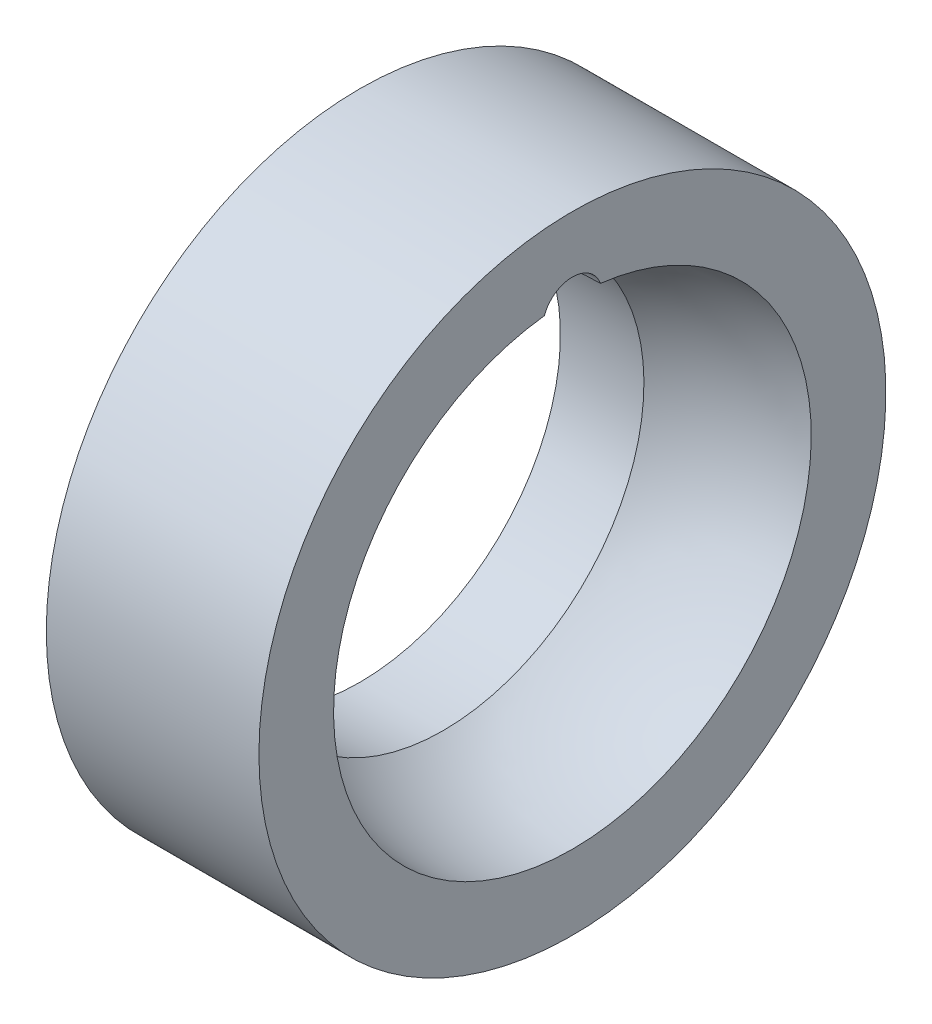
ISO-10303-21;
HEADER;
FILE_DESCRIPTION(('STEP AP214'),'2;1');
FILE_NAME('part.step','',(''),(''),'','','');
FILE_SCHEMA(('AUTOMOTIVE_DESIGN { 1 0 10303 214 1 1 1 1 }'));
ENDSEC;
DATA;
#1=APPLICATION_CONTEXT('core data for automotive mechanical design processes');
#2=APPLICATION_PROTOCOL_DEFINITION('international standard','automotive_design',2000,#1);
#3=PRODUCT_CONTEXT('',#1,'mechanical');
#4=PRODUCT('Part','Part','',(#3));
#5=PRODUCT_RELATED_PRODUCT_CATEGORY('part','',(#4));
#6=PRODUCT_DEFINITION_FORMATION('','',#4);
#7=PRODUCT_DEFINITION_CONTEXT('part definition',#1,'design');
#8=PRODUCT_DEFINITION('design','',#6,#7);
#9=PRODUCT_DEFINITION_SHAPE('','',#8);
#10=(LENGTH_UNIT() NAMED_UNIT(*) SI_UNIT(.MILLI.,.METRE.));
#11=(NAMED_UNIT(*) PLANE_ANGLE_UNIT() SI_UNIT($,.RADIAN.));
#12=(NAMED_UNIT(*) SI_UNIT($,.STERADIAN.) SOLID_ANGLE_UNIT());
#13=UNCERTAINTY_MEASURE_WITH_UNIT(LENGTH_MEASURE(1.E-05),#10,'distance_accuracy_value','');
#14=(GEOMETRIC_REPRESENTATION_CONTEXT(3) GLOBAL_UNCERTAINTY_ASSIGNED_CONTEXT((#13)) GLOBAL_UNIT_ASSIGNED_CONTEXT((#10,
#11,#12)) REPRESENTATION_CONTEXT('',''));
#15=CARTESIAN_POINT('',(0.,0.,0.));
#16=DIRECTION('',(0.,0.,1.));
#17=DIRECTION('',(1.,0.,0.));
#18=AXIS2_PLACEMENT_3D('',#15,#16,#17);
#19=CARTESIAN_POINT('',(20.1221335353163,0.,0.));
#20=DIRECTION('',(-1.,0.,0.));
#21=DIRECTION('',(0.,0.,1.));
#22=AXIS2_PLACEMENT_3D('',#19,#20,#21);
#23=DEGENERATE_TOROIDAL_SURFACE('',#22,7.64433946143228E-05,40.,.T.);
#24=CARTESIAN_POINT('',(-15.6421895674782,17.2811774003063,-4.71983468836695));
#25=CARTESIAN_POINT('',(-15.2759094662814,18.039375351379,-4.71957062717062));
#26=CARTESIAN_POINT('',(-14.8854597789707,18.7858851714259,-4.71928898190261));
#27=CARTESIAN_POINT('',(-14.0580147759953,20.2524704751657,-4.71869164080727));
#28=CARTESIAN_POINT('',(-13.6210278510322,20.9725506927613,-4.71837595111806));
#29=CARTESIAN_POINT('',(-12.7016849026117,22.3842368413886,-4.71771119302702));
#30=CARTESIAN_POINT('',(-12.2192815767361,23.0758119815962,-4.71736208981767));
#31=CARTESIAN_POINT('',(-11.211412658642,24.4269654886847,-4.71663197884782));
#32=CARTESIAN_POINT('',(-10.6859397885119,25.0865384177153,-4.71625096569494));
#33=CARTESIAN_POINT('',(-9.41688332634966,26.5793554903486,-4.71532976651777));
#34=CARTESIAN_POINT('',(-8.6578392707403,27.3995357837632,-4.71477803823838));
#35=CARTESIAN_POINT('',(-7.07328234131406,28.9731399255364,-4.71362437186993));
#36=CARTESIAN_POINT('',(-6.24775770799117,29.7265519137693,-4.71302242489717));
#37=CARTESIAN_POINT('',(-4.53585980904716,31.1614361084501,-4.71177194055376));
#38=CARTESIAN_POINT('',(-3.64946477067534,31.8428823499325,-4.7111233865083));
#39=CARTESIAN_POINT('',(-1.82246757275344,33.1286166937965,-4.70978407789049));
#40=CARTESIAN_POINT('',(-0.88186884754735,33.7329096768222,-4.70909332599163));
#41=CARTESIAN_POINT('',(1.04704523012668,34.8601814794487,-4.70767395027811));
#42=CARTESIAN_POINT('',(2.0353678309726,35.3831478958113,-4.70694532070925));
#43=CARTESIAN_POINT('',(4.05266715474154,36.343978425912,-4.70545499245545));
#44=CARTESIAN_POINT('',(5.08164748983984,36.7818349576416,-4.70469329083168));
#45=CARTESIAN_POINT('',(7.17214736284044,37.5690157923693,-4.70314247596952));
#46=CARTESIAN_POINT('',(8.23364578718109,37.9183962310181,-4.70235338047503));
#47=CARTESIAN_POINT('',(10.3820974273785,38.5264342162221,-4.70075275727532));
#48=CARTESIAN_POINT('',(11.4690426573696,38.7851198285868,-4.69994123659365));
#49=CARTESIAN_POINT('',(13.180976714135,39.1170471852923,-4.69866024985119));
#50=CARTESIAN_POINT('',(13.8000098295327,39.2219054474565,-4.69819647520254));
#51=CARTESIAN_POINT('',(15.0424118188191,39.4021840288831,-4.69726451216471));
#52=CARTESIAN_POINT('',(15.6657808391783,39.4776033487095,-4.69679632362622));
#53=CARTESIAN_POINT('',(16.9142559097397,39.5987014405652,-4.69585746397916));
#54=CARTESIAN_POINT('',(17.5393568038199,39.6444335733849,-4.69538679886634));
#55=CARTESIAN_POINT('',(18.7910036274531,39.7062870284667,-4.69444319907033));
#56=CARTESIAN_POINT('',(19.4175495147356,39.7224092061792,-4.69397026445309));
#57=CARTESIAN_POINT('',(20.0441320920677,39.7236846216102,-4.6934967053881));
#58=B_SPLINE_CURVE_WITH_KNOTS('',3,(#24,#25,#26,#27,#28,#29,#30,#31,#32,#33,#34,#35,#36,#37,#38,
#39,#40,#41,#42,#43,#44,#45,#46,#47,#48,#49,#50,#51,#52,#53,#54,#55,#56,#57),.UNSPECIFIED.,.F.,
.F.,(4,2,2,2,2,2,2,2,2,2,2,2,2,2,2,2,4),(0.,2.52566580639146,5.05087700171165,7.57874799959324,
10.1070470424515,13.455450692087,16.8044479350535,20.1546493847703,23.5046387987118,
26.85513862462,30.2059367929227,33.5546036149888,36.9022332646503,38.7851823646233,
40.6681953841313,42.5478143691044,44.4273790498379),.UNSPECIFIED.);
#59=CARTESIAN_POINT('',(-1.57648479448589,33.2715304538644,-4.70960309524829));
#60=VERTEX_POINT('',#59);
#61=CARTESIAN_POINT('',(20.0439320920677,39.7236842105263,-4.69349685654329));
#62=VERTEX_POINT('',#61);
#63=EDGE_CURVE('E56',#60,#62,#58,.T.);
#64=ORIENTED_EDGE('',*,*,#63,.F.);
#65=CARTESIAN_POINT('',(-1.57648479448589,0.,0.));
#66=DIRECTION('',(1.,0.,0.));
#67=DIRECTION('',(0.,0.,-1.));
#68=AXIS2_PLACEMENT_3D('',#65,#66,#67);
#69=CIRCLE('',#68,33.6032007412567);
#70=CARTESIAN_POINT('',(-1.57648479448579,33.2715304538644,4.70960309524831));
#71=VERTEX_POINT('',#70);
#72=EDGE_CURVE('E49',#60,#71,#69,.F.);
#73=ORIENTED_EDGE('',*,*,#72,.T.);
#74=CARTESIAN_POINT('',(20.0441320920677,39.7236846216102,4.6934967053881));
#75=CARTESIAN_POINT('',(19.2020977600012,39.7219935452299,4.69413310124834));
#76=CARTESIAN_POINT('',(18.360128119361,39.6934553314011,4.69476836651866));
#77=CARTESIAN_POINT('',(16.6798513751535,39.5829764240403,4.69603401399014));
#78=CARTESIAN_POINT('',(15.8415436396381,39.5010453434236,4.69666439704964));
#79=CARTESIAN_POINT('',(14.1709388640504,39.2839574043864,4.69791854932067));
#80=CARTESIAN_POINT('',(13.3386490858657,39.1487445689039,4.69854231086569));
#81=CARTESIAN_POINT('',(11.6842544026417,38.8256463592424,4.69978015586335));
#82=CARTESIAN_POINT('',(10.8621512460708,38.6377520698997,4.70039423765931));
#83=CARTESIAN_POINT('',(8.9669294331129,38.1406105195804,4.70180759884834));
#84=CARTESIAN_POINT('',(7.89888807572996,37.8117694630523,4.7026023389578));
#85=CARTESIAN_POINT('',(5.79417999172329,37.0652606022522,4.7041652030577));
#86=CARTESIAN_POINT('',(4.7575188606651,36.6475770613764,4.70493332230476));
#87=CARTESIAN_POINT('',(2.72267764550524,35.7262033147961,4.70643801682719));
#88=CARTESIAN_POINT('',(1.72451153147418,35.2224822389668,4.70717458066148));
#89=CARTESIAN_POINT('',(-0.225759257360639,34.1327588563438,4.70861095669298));
#90=CARTESIAN_POINT('',(-1.17786684346002,33.5467617592642,4.7093107712133));
#91=CARTESIAN_POINT('',(-3.02946274596384,32.2965360673289,4.7106692626734));
#92=CARTESIAN_POINT('',(-3.92894304052079,31.6322955922854,4.71132793334275));
#93=CARTESIAN_POINT('',(-5.66881095448404,30.230307450833,4.71259985572707));
#94=CARTESIAN_POINT('',(-6.5091933048119,29.4925532441944,4.71321310339245));
#95=CARTESIAN_POINT('',(-8.12425851096681,27.9493658748685,4.71438983708653));
#96=CARTESIAN_POINT('',(-8.89898281846065,27.1439760615499,4.71495335452067));
#97=CARTESIAN_POINT('',(-10.3776885275345,25.4709537232032,4.71602744120769));
#98=CARTESIAN_POINT('',(-11.0816917663283,24.6033405541724,4.71653802680641));
#99=CARTESIAN_POINT('',(-12.1224402166282,23.2041517450131,4.71729192492435));
#100=CARTESIAN_POINT('',(-12.4851020696186,22.6916400905935,4.71755443427787));
#101=CARTESIAN_POINT('',(-13.1857716142651,21.649957054734,4.71806128199336));
#102=CARTESIAN_POINT('',(-13.5237784686572,21.1207851083969,4.71830561973825));
#103=CARTESIAN_POINT('',(-14.1737395640294,20.0479926104995,4.71877519149096));
#104=CARTESIAN_POINT('',(-14.4857396646426,19.5043998205052,4.71900045913793));
#105=CARTESIAN_POINT('',(-15.0836776832613,18.4030850132656,4.71943195550539));
#106=CARTESIAN_POINT('',(-15.3696163538505,17.845363404617,4.71963818477565));
#107=CARTESIAN_POINT('',(-15.6421895674782,17.2811774003063,4.71983468836695));
#108=B_SPLINE_CURVE_WITH_KNOTS('',3,(#74,#75,#76,#77,#78,#79,#80,#81,#82,#83,#84,#85,#86,#87,
#88,#89,#90,#91,#92,#93,#94,#95,#96,#97,#98,#99,#100,#101,#102,#103,#104,#105,#106,#107),
.UNSPECIFIED.,.F.,.F.,(4,2,2,2,2,2,2,2,2,2,2,2,2,2,2,2,4),(0.,2.52566539656058,5.05087619489672,
7.57874704756247,10.1070459445906,13.4554569973194,16.804461646277,20.1546704464661,
23.5046672071691,26.8551732763477,30.2059776935552,33.5546506507731,36.9022864075529,
38.7852221765655,40.6682218588213,42.547827587021,44.427379020074),.UNSPECIFIED.);
#109=CARTESIAN_POINT('',(20.0439320920677,39.7236842105263,4.69349685654334));
#110=VERTEX_POINT('',#109);
#111=EDGE_CURVE('E69',#110,#71,#108,.T.);
#112=ORIENTED_EDGE('',*,*,#111,.F.);
#113=CARTESIAN_POINT('',(20.0439320920677,0.,0.));
#114=DIRECTION('',(-1.,0.,0.));
#115=DIRECTION('',(0.,0.,1.));
#116=AXIS2_PLACEMENT_3D('',#113,#114,#115);
#117=CIRCLE('',#116,40.);
#118=EDGE_CURVE('E11',#62,#110,#117,.T.);
#119=ORIENTED_EDGE('',*,*,#118,.F.);
#120=EDGE_LOOP('',(#64,#73,#112,#119));
#121=FACE_BOUND('',#120,.T.);
#122=ADVANCED_FACE('F35',(#121),#23,.F.);
#123=CARTESIAN_POINT('',(20.0439320920677,40.,0.));
#124=DIRECTION('',(-1.,0.,0.));
#125=DIRECTION('',(0.,0.,1.));
#126=AXIS2_PLACEMENT_3D('',#123,#124,#125);
#127=PLANE('',#126);
#128=CARTESIAN_POINT('',(20.0439320920677,38.,0.));
#129=DIRECTION('',(1.,0.,0.));
#130=DIRECTION('',(0.,0.,-1.));
#131=AXIS2_PLACEMENT_3D('',#128,#129,#130);
#132=CIRCLE('',#131,5.);
#133=EDGE_CURVE('E73',#62,#110,#132,.T.);
#134=ORIENTED_EDGE('',*,*,#133,.F.);
#135=ORIENTED_EDGE('',*,*,#118,.T.);
#136=EDGE_LOOP('',(#134,#135));
#137=FACE_BOUND('',#136,.T.);
#138=CARTESIAN_POINT('',(20.0439320920677,0.,0.));
#139=DIRECTION('',(-1.,0.,0.));
#140=DIRECTION('',(0.,0.,1.));
#141=AXIS2_PLACEMENT_3D('',#138,#139,#140);
#142=CIRCLE('',#141,52.5);
#143=CARTESIAN_POINT('',(20.0439320920677,0.,52.5));
#144=VERTEX_POINT('',#143);
#145=EDGE_CURVE('E43',#144,#144,#142,.T.);
#146=ORIENTED_EDGE('',*,*,#145,.F.);
#147=EDGE_LOOP('',(#146));
#148=FACE_BOUND('',#147,.T.);
#149=ADVANCED_FACE('F110',(#137,#148),#127,.F.);
#150=CARTESIAN_POINT('',(-142.821782178218,0.,0.));
#151=DIRECTION('',(-1.,0.,0.));
#152=DIRECTION('',(0.,0.,1.));
#153=AXIS2_PLACEMENT_3D('',#150,#151,#152);
#154=CYLINDRICAL_SURFACE('',#153,52.5);
#155=CARTESIAN_POINT('',(-15.5635250098427,0.,0.));
#156=DIRECTION('',(1.,0.,0.));
#157=DIRECTION('',(0.,1.,0.));
#158=AXIS2_PLACEMENT_3D('',#155,#156,#157);
#159=CIRCLE('',#158,52.5);
#160=CARTESIAN_POINT('',(-15.5635250098427,52.5,0.));
#161=VERTEX_POINT('',#160);
#162=EDGE_CURVE('E70',#161,#161,#159,.T.);
#163=ORIENTED_EDGE('',*,*,#162,.T.);
#164=EDGE_LOOP('',(#163));
#165=FACE_BOUND('',#164,.T.);
#166=ORIENTED_EDGE('',*,*,#145,.T.);
#167=EDGE_LOOP('',(#166));
#168=FACE_BOUND('',#167,.T.);
#169=ADVANCED_FACE('F92',(#165,#168),#154,.T.);
#170=CARTESIAN_POINT('',(20.0439320920677,0.,0.));
#171=DIRECTION('',(0.,0.,1.));
#172=DIRECTION('',(1.,0.,0.));
#173=AXIS2_PLACEMENT_3D('',#170,#171,#172);
#174=TOROIDAL_SURFACE('',#173,38.,5.);
#175=CARTESIAN_POINT('',(20.0441320920677,33.5286197375245,-2.23757872569411));
#176=CARTESIAN_POINT('',(19.8614359959345,33.5286203766609,-2.23755049472049));
#177=CARTESIAN_POINT('',(19.6787453807373,33.528444301127,-2.24020721472335));
#178=CARTESIAN_POINT('',(19.3135365267476,33.5277425241715,-2.25069566483876));
#179=CARTESIAN_POINT('',(19.1310182684824,33.5272168686286,-2.25852671587375));
#180=CARTESIAN_POINT('',(18.7664902408934,33.5258205863803,-2.2791564267382));
#181=CARTESIAN_POINT('',(18.5844801227985,33.5249503817334,-2.29194900850621));
#182=CARTESIAN_POINT('',(18.2208444622175,33.5228721913829,-2.32214770104332));
#183=CARTESIAN_POINT('',(18.0392189314854,33.5216641955015,-2.33955395082194));
#184=CARTESIAN_POINT('',(17.4965397322085,33.5175579709359,-2.39789956366987));
#185=CARTESIAN_POINT('',(17.1361533699163,33.5141714989145,-2.44505923534508));
#186=CARTESIAN_POINT('',(16.4172435048074,33.5061832246551,-2.55218529951695));
#187=CARTESIAN_POINT('',(16.0587206728647,33.5015810119904,-2.61215601563452));
#188=CARTESIAN_POINT('',(15.3416893285763,33.4912491143816,-2.74145136188306));
#189=CARTESIAN_POINT('',(14.9831886007053,33.4855142973166,-2.81081810086654));
#190=CARTESIAN_POINT('',(14.2674451959428,33.4730610253935,-2.95542772996307));
#191=CARTESIAN_POINT('',(13.9102024025879,33.4663426641849,-3.03067006030531));
#192=CARTESIAN_POINT('',(13.1960561615703,33.4520624054686,-3.18442955074408));
#193=CARTESIAN_POINT('',(12.8391534566264,33.4444996353426,-3.26295004508112));
#194=CARTESIAN_POINT('',(12.1255768859799,33.4287061780495,-3.42096680710387));
#195=CARTESIAN_POINT('',(11.7689030232474,33.4204754823833,-3.5004630871951));
#196=CARTESIAN_POINT('',(11.0592574211405,33.4036326265313,-3.65767749026961));
#197=CARTESIAN_POINT('',(10.7062878035093,33.3950256157325,-3.73540555125491));
#198=CARTESIAN_POINT('',(9.9998106169779,33.377565344303,-3.88834003186973));
#199=CARTESIAN_POINT('',(9.64630304367605,33.3687120816469,-3.96354643074912));
#200=CARTESIAN_POINT('',(8.5845336272386,33.3421375941129,-4.18311849152067));
#201=CARTESIAN_POINT('',(7.874967098912,33.3244002146776,-4.32145039355336));
#202=CARTESIAN_POINT('',(6.80842315029147,33.2995690409918,-4.50752780034862));
#203=CARTESIAN_POINT('',(6.45332621025471,33.2916033840068,-4.56587854134496));
#204=CARTESIAN_POINT('',(5.74181241876006,33.2766004701332,-4.67396106063569));
#205=CARTESIAN_POINT('',(5.38539565780537,33.2695631507554,-4.72369341913005));
#206=CARTESIAN_POINT('',(4.67138174871472,33.256800584116,-4.81272773528703));
#207=CARTESIAN_POINT('',(4.31378519312108,33.251074757263,-4.85203430166606));
#208=CARTESIAN_POINT('',(3.59743993347669,33.2413534233496,-4.91819573074715));
#209=CARTESIAN_POINT('',(3.23869140797356,33.2373576600568,-4.94505243738698));
#210=CARTESIAN_POINT('',(2.58692799363487,33.2320886519737,-4.98032518931239));
#211=CARTESIAN_POINT('',(2.29405334082857,33.2304480743238,-4.99123647026337));
#212=CARTESIAN_POINT('',(1.70806585514612,33.2288749065916,-5.0017004930448));
#213=CARTESIAN_POINT('',(1.41495301623826,33.2289423612015,-5.00125293766026));
#214=CARTESIAN_POINT('',(0.828099605210108,33.2310502030662,-4.98722986213768));
#215=CARTESIAN_POINT('',(0.534359948743438,33.2330967793932,-4.97361315967728));
#216=CARTESIAN_POINT('',(-0.0520158618488431,33.239426970555,-4.93113249833188));
#217=CARTESIAN_POINT('',(-0.344652069471564,33.2437104754978,-4.90226928845055));
#218=CARTESIAN_POINT('',(-0.931403459033836,33.2548109797353,-4.82640201190726));
#219=CARTESIAN_POINT('',(-1.22548924846173,33.2616598577986,-4.77916938100923));
#220=CARTESIAN_POINT('',(-1.80961293256311,33.2780547508645,-4.66364694119683));
#221=CARTESIAN_POINT('',(-2.09964939667282,33.2876016949539,-4.59534987794339));
#222=CARTESIAN_POINT('',(-2.67160621430052,33.309386126399,-4.4346896115383));
#223=CARTESIAN_POINT('',(-2.95355686457211,33.3216114901122,-4.34243451442376));
#224=CARTESIAN_POINT('',(-3.50649535737253,33.3485969256522,-4.1300922618542));
#225=CARTESIAN_POINT('',(-3.77749524977579,33.3633541122074,-4.0100367339683));
#226=CARTESIAN_POINT('',(-4.29534130778432,33.3944343785074,-3.74225911548667));
#227=CARTESIAN_POINT('',(-4.54266663935543,33.4106976763207,-3.59546829256295));
#228=CARTESIAN_POINT('',(-5.01497599543287,33.4442611369731,-3.26855985527216));
#229=CARTESIAN_POINT('',(-5.23994852074835,33.4615618262256,-3.08842522251896));
#230=CARTESIAN_POINT('',(-5.5541390693144,33.4872408419405,-2.79102284765326));
#231=CARTESIAN_POINT('',(-5.6555896250929,33.4958115517178,-2.68656338460418));
#232=CARTESIAN_POINT('',(-5.84854722005057,33.5125624192654,-2.46884329038777));
#233=CARTESIAN_POINT('',(-5.94006007604458,33.5207428039145,-2.355587875059));
#234=CARTESIAN_POINT('',(-6.11139652527893,33.5364173357318,-2.12075821802858));
#235=CARTESIAN_POINT('',(-6.19123939514745,33.5439126067262,-1.99919819286081));
#236=CARTESIAN_POINT('',(-6.33768849560451,33.5579214684696,-1.74836954685358));
#237=CARTESIAN_POINT('',(-6.40430098736992,33.5644355232175,-1.61910461014194));
#238=CARTESIAN_POINT('',(-6.54676080421165,33.5785665108598,-1.29988645131197));
#239=CARTESIAN_POINT('',(-6.61538321624216,33.5855580104864,-1.10659549620199));
#240=CARTESIAN_POINT('',(-6.71935254068754,33.5962540311902,-0.711241427949875));
#241=CARTESIAN_POINT('',(-6.75471850988172,33.5999604346401,-0.509183408089962));
#242=CARTESIAN_POINT('',(-6.79008376381403,33.6036666994528,-0.10147220665783));
#243=CARTESIAN_POINT('',(-6.79000640807797,33.603658528648,0.104187804135051));
#244=CARTESIAN_POINT('',(-6.75428375049168,33.5999149312358,0.512346425980999));
#245=CARTESIAN_POINT('',(-6.71863457231691,33.5961790984185,0.714844690050392));
#246=CARTESIAN_POINT('',(-6.6155703908368,33.5855783022911,1.10501850485821));
#247=CARTESIAN_POINT('',(-6.54911907252624,33.5788084612767,1.29295472187712));
#248=CARTESIAN_POINT('',(-6.3883864751207,33.562849446375,1.65631191070632));
#249=CARTESIAN_POINT('',(-6.29409991510372,33.5536598134389,1.8317304998145));
#250=CARTESIAN_POINT('',(-6.07180733995683,33.5326969317565,2.18341643501878));
#251=CARTESIAN_POINT('',(-5.94144698867356,33.5207610740389,2.35817730053171));
#252=CARTESIAN_POINT('',(-5.65804068235424,33.4959284197364,2.68798258188616));
#253=CARTESIAN_POINT('',(-5.50498072928236,33.4830310326686,2.8430147213315));
#254=CARTESIAN_POINT('',(-5.08236671382082,33.4492256491774,3.22176806764013));
#255=CARTESIAN_POINT('',(-4.79864929243145,33.4282241862645,3.4297974931164));
#256=CARTESIAN_POINT('',(-4.35146042747861,33.3983362131286,3.7060328249767));
#257=CARTESIAN_POINT('',(-4.19851820152634,33.3886275422644,3.79225851133241));
#258=CARTESIAN_POINT('',(-3.88681510381763,33.3699110602599,3.95357416687014));
#259=CARTESIAN_POINT('',(-3.72805535188814,33.3609031152672,4.02866626528079));
#260=CARTESIAN_POINT('',(-3.30979353792136,33.3385886892426,4.21026741928814));
#261=CARTESIAN_POINT('',(-3.04677125861262,33.3259293687177,4.30874297707918));
#262=CARTESIAN_POINT('',(-2.51305290534579,33.3029974775976,4.48253153250054));
#263=CARTESIAN_POINT('',(-2.24235186893276,33.2927264918145,4.55782916076568));
#264=CARTESIAN_POINT('',(-1.69587868686703,33.2746105108523,4.68825350073782));
#265=CARTESIAN_POINT('',(-1.42010241437802,33.2667675915328,4.74336296003654));
#266=CARTESIAN_POINT('',(-0.865689556233015,33.2534309536077,4.83596821586187));
#267=CARTESIAN_POINT('',(-0.58705370029579,33.2479366502225,4.87346839713427));
#268=CARTESIAN_POINT('',(0.0453523151223846,33.2379684451434,4.94105657705588));
#269=CARTESIAN_POINT('',(0.399612139502436,33.2341428182784,4.96660219803581));
#270=CARTESIAN_POINT('',(1.10909420687818,33.2295408286751,4.99729043097956));
#271=CARTESIAN_POINT('',(1.46431679383803,33.2287657576045,5.0024244002414));
#272=CARTESIAN_POINT('',(2.175150167897,33.2298040198122,4.99552055511286));
#273=CARTESIAN_POINT('',(2.53076059242929,33.2316217426712,4.98345361974228));
#274=CARTESIAN_POINT('',(3.24109277876375,33.2373901490706,4.94483215255146));
#275=CARTESIAN_POINT('',(3.59581465279373,33.2413405480189,4.91827955374615));
#276=CARTESIAN_POINT('',(4.30780496306782,33.2509844687539,4.85265254476176));
#277=CARTESIAN_POINT('',(4.66506106316534,33.2566958466059,4.81344966365011));
#278=CARTESIAN_POINT('',(5.37824653464891,33.2694272730556,4.7246498797222));
#279=CARTESIAN_POINT('',(5.73417586889637,33.2764473580099,4.67505268814118));
#280=CARTESIAN_POINT('',(6.44439579240096,33.2914073625465,4.56730188971497));
#281=CARTESIAN_POINT('',(6.79868751270208,33.2993464994545,4.50915555217785));
#282=CARTESIAN_POINT('',(7.50604576872357,33.3158069709788,4.38588398351638));
#283=CARTESIAN_POINT('',(7.85911225207771,33.3243283301648,4.32075845780563));
#284=CARTESIAN_POINT('',(8.7102745995444,33.3452324053851,4.15690919949113));
#285=CARTESIAN_POINT('',(9.20783651820243,33.3577518532897,4.05544661127178));
#286=CARTESIAN_POINT('',(10.2014924776126,33.3825828929609,3.84570002625117));
#287=CARTESIAN_POINT('',(10.6975865413552,33.3948944879974,3.7374161368876));
#288=CARTESIAN_POINT('',(11.6889613561137,33.4186758326325,3.5184243564722));
#289=CARTESIAN_POINT('',(12.1842424076902,33.4301460520022,3.40771786357824));
#290=CARTESIAN_POINT('',(13.175513002846,33.4517330507879,3.18884547669265));
#291=CARTESIAN_POINT('',(13.6715026772614,33.4618495348222,3.0806801414061));
#292=CARTESIAN_POINT('',(14.6513446408276,33.4800323633912,2.87623671368284));
#293=CARTESIAN_POINT('',(15.1351420071344,33.4881487335716,2.77970841632046));
#294=CARTESIAN_POINT('',(15.8629323290634,33.4988076475077,2.64707308677242));
#295=CARTESIAN_POINT('',(16.1057992867772,33.5021071898268,2.6048991691995));
#296=CARTESIAN_POINT('',(16.5923974447846,33.5081675396407,2.5257422057534));
#297=CARTESIAN_POINT('',(16.8361286608728,33.5109283372377,2.48875925525264));
#298=CARTESIAN_POINT('',(17.3254973062054,33.5158888364981,2.42104521182589));
#299=CARTESIAN_POINT('',(17.5711384521529,33.5180861812871,2.39034048518471));
#300=CARTESIAN_POINT('',(18.0632484407876,33.5218767535398,2.33657922286309));
#301=CARTESIAN_POINT('',(18.3097172012704,33.5234700393107,2.31352194903357));
#302=CARTESIAN_POINT('',(18.8039417144869,33.5260331262563,2.27608866620013));
#303=CARTESIAN_POINT('',(19.0516991424838,33.5270013770302,2.26173424996909));
#304=CARTESIAN_POINT('',(19.5476737562099,33.528295749916,2.24243353020754));
#305=CARTESIAN_POINT('',(19.7958910825929,33.5286216237771,2.23749086393402));
#306=CARTESIAN_POINT('',(20.0441320920677,33.5286197375245,2.23757872569412));
#307=B_SPLINE_CURVE_WITH_KNOTS('',3,(#175,#176,#177,#178,#179,#180,#181,#182,#183,#184,#185,
#186,#187,#188,#189,#190,#191,#192,#193,#194,#195,#196,#197,#198,#199,#200,#201,#202,#203,#204,
#205,#206,#207,#208,#209,#210,#211,#212,#213,#214,#215,#216,#217,#218,#219,#220,#221,#222,#223,
#224,#225,#226,#227,#228,#229,#230,#231,#232,#233,#234,#235,#236,#237,#238,#239,#240,#241,#242,
#243,#244,#245,#246,#247,#248,#249,#250,#251,#252,#253,#254,#255,#256,#257,#258,#259,#260,#261,
#262,#263,#264,#265,#266,#267,#268,#269,#270,#271,#272,#273,#274,#275,#276,#277,#278,#279,#280,
#281,#282,#283,#284,#285,#286,#287,#288,#289,#290,#291,#292,#293,#294,#295,#296,#297,#298,#299,
#300,#301,#302,#303,#304,#305,#306),.UNSPECIFIED.,.F.,.F.,(4,2,2,2,2,2,2,2,2,2,2,2,2,2,2,2,2,2,
2,2,2,2,2,2,2,2,2,2,2,2,2,2,2,2,2,2,2,2,2,2,2,2,2,2,2,2,2,2,2,2,2,2,2,2,2,2,2,2,2,2,2,2,2,2,2,
4),(0.,0.54805992441155,1.09604793589447,1.643366751128,2.19070205891722,3.28077872268402,
4.37122386111823,5.46672839689182,6.56212869038298,7.65867164285317,8.75522855054673,
9.83980653655137,10.9243934450864,13.0933886895752,14.1731469433735,15.2528324782738,
16.332039940267,17.4110875106849,18.2901449190283,19.1692253287872,20.0510637018732,
20.9328587575791,21.8259960394341,22.7194412512108,23.6089229703946,24.4973976864803,
25.3593910084938,26.2218255034841,26.6589286579399,27.0957745686944,27.5318905331079,
27.9677996145709,28.5806306155824,29.1931102346196,29.8069142482947,30.4207851565866,
31.016627186834,31.6125823333847,32.2652258239606,32.9182734630055,33.9691626911186,
34.4963942521555,35.0235248530557,35.8655868921602,36.7082061086018,37.5515437400692,
38.3946712672653,39.4595141040741,40.5248077686706,41.5919071095543,42.6588640879839,
43.7370169213559,44.8151997109071,45.8924709713555,46.9697877205553,48.493566031461,
50.0173203483672,51.5402173169117,53.0634460377561,54.5434550737246,55.2829815398534,
56.0225215913498,56.7651063898848,57.5076194916185,58.2519673924817,58.9966028950739),.UNSPECIFIED.);
#308=EDGE_CURVE('E61',#60,#71,#307,.T.);
#309=ORIENTED_EDGE('',*,*,#308,.F.);
#310=ORIENTED_EDGE('',*,*,#63,.T.);
#311=ORIENTED_EDGE('',*,*,#133,.T.);
#312=ORIENTED_EDGE('',*,*,#111,.T.);
#313=EDGE_LOOP('',(#309,#310,#311,#312));
#314=FACE_BOUND('',#313,.T.);
#315=ADVANCED_FACE('F72',(#314),#174,.F.);
#316=CARTESIAN_POINT('',(-15.5635250098427,86.2958523833639,-52.5));
#317=DIRECTION('',(1.,0.,0.));
#318=DIRECTION('',(0.,1.,0.));
#319=AXIS2_PLACEMENT_3D('',#316,#317,#318);
#320=PLANE('',#319);
#321=CARTESIAN_POINT('',(-15.5635250098427,0.,0.));
#322=DIRECTION('',(-1.,0.,0.));
#323=DIRECTION('',(0.,-1.,0.));
#324=AXIS2_PLACEMENT_3D('',#321,#322,#323);
#325=CIRCLE('',#324,33.6032007412567);
#326=CARTESIAN_POINT('',(-15.5635250098427,-33.6032007412567,0.));
#327=VERTEX_POINT('',#326);
#328=EDGE_CURVE('E64',#327,#327,#325,.T.);
#329=ORIENTED_EDGE('',*,*,#328,.F.);
#330=EDGE_LOOP('',(#329));
#331=FACE_BOUND('',#330,.T.);
#332=ORIENTED_EDGE('',*,*,#162,.F.);
#333=EDGE_LOOP('',(#332));
#334=FACE_BOUND('',#333,.T.);
#335=ADVANCED_FACE('F91',(#331,#334),#320,.F.);
#336=CARTESIAN_POINT('',(20.0439320920677,0.,0.));
#337=DIRECTION('',(-1.,0.,0.));
#338=DIRECTION('',(0.,-1.,0.));
#339=AXIS2_PLACEMENT_3D('',#336,#337,#338);
#340=CYLINDRICAL_SURFACE('',#339,33.6032007412567);
#341=ORIENTED_EDGE('',*,*,#328,.T.);
#342=EDGE_LOOP('',(#341));
#343=FACE_BOUND('',#342,.T.);
#344=ORIENTED_EDGE('',*,*,#308,.T.);
#345=ORIENTED_EDGE('',*,*,#72,.F.);
#346=EDGE_LOOP('',(#344,#345));
#347=FACE_BOUND('',#346,.T.);
#348=ADVANCED_FACE('F62',(#343,#347),#340,.F.);
#349=CLOSED_SHELL('',(#122,#149,#169,#315,#335,#348));
#350=MANIFOLD_SOLID_BREP('B2',#349);
#351=ADVANCED_BREP_SHAPE_REPRESENTATION('',(#18,#350),#14);
#352=SHAPE_DEFINITION_REPRESENTATION(#9,#351);
ENDSEC;
END-ISO-10303-21;
